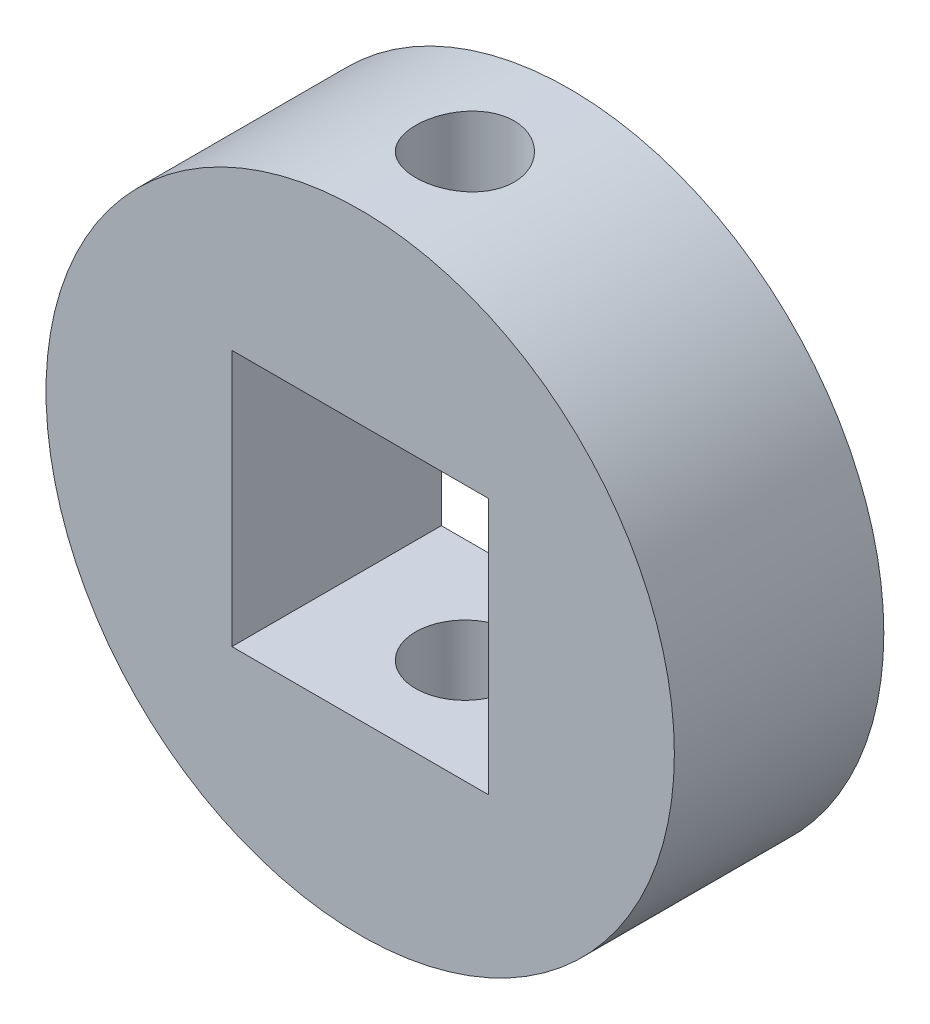
ISO-10303-21;
HEADER;
FILE_DESCRIPTION(('STEP AP214'),'2;1');
FILE_NAME('part.step','',(''),(''),'','','');
FILE_SCHEMA(('AUTOMOTIVE_DESIGN { 1 0 10303 214 1 1 1 1 }'));
ENDSEC;
DATA;
#1=APPLICATION_CONTEXT('core data for automotive mechanical design processes');
#2=APPLICATION_PROTOCOL_DEFINITION('international standard','automotive_design',2000,#1);
#3=PRODUCT_CONTEXT('',#1,'mechanical');
#4=PRODUCT('Part','Part','',(#3));
#5=PRODUCT_RELATED_PRODUCT_CATEGORY('part','',(#4));
#6=PRODUCT_DEFINITION_FORMATION('','',#4);
#7=PRODUCT_DEFINITION_CONTEXT('part definition',#1,'design');
#8=PRODUCT_DEFINITION('design','',#6,#7);
#9=PRODUCT_DEFINITION_SHAPE('','',#8);
#10=(LENGTH_UNIT() NAMED_UNIT(*) SI_UNIT(.MILLI.,.METRE.));
#11=(NAMED_UNIT(*) PLANE_ANGLE_UNIT() SI_UNIT($,.RADIAN.));
#12=(NAMED_UNIT(*) SI_UNIT($,.STERADIAN.) SOLID_ANGLE_UNIT());
#13=UNCERTAINTY_MEASURE_WITH_UNIT(LENGTH_MEASURE(1.E-05),#10,'distance_accuracy_value','');
#14=(GEOMETRIC_REPRESENTATION_CONTEXT(3) GLOBAL_UNCERTAINTY_ASSIGNED_CONTEXT((#13)) GLOBAL_UNIT_ASSIGNED_CONTEXT((#10,
#11,#12)) REPRESENTATION_CONTEXT('',''));
#15=CARTESIAN_POINT('',(0.,0.,0.));
#16=DIRECTION('',(0.,0.,1.));
#17=DIRECTION('',(1.,0.,0.));
#18=AXIS2_PLACEMENT_3D('',#15,#16,#17);
#19=CARTESIAN_POINT('',(0.,0.,10.));
#20=DIRECTION('',(0.,0.,-1.));
#21=DIRECTION('',(-1.,0.,0.));
#22=AXIS2_PLACEMENT_3D('',#19,#20,#21);
#23=CYLINDRICAL_SURFACE('',#22,15.);
#24=CARTESIAN_POINT('',(0.,-15.,2.65));
#25=CARTESIAN_POINT('',(0.131139660898044,-14.9999978361734,2.65000535255428));
#26=CARTESIAN_POINT('',(0.262353665254958,-14.9982622581592,2.66101426651047));
#27=CARTESIAN_POINT('',(0.521109191759034,-14.9915057642154,2.70474512698628));
#28=CARTESIAN_POINT('',(0.648647094187166,-14.9864817183713,2.73748775975335));
#29=CARTESIAN_POINT('',(0.896268668958393,-14.9737124613582,2.82367958932411));
#30=CARTESIAN_POINT('',(1.01635807129278,-14.9659693732295,2.87711263429627));
#31=CARTESIAN_POINT('',(1.24584930355545,-14.9486159955958,3.00312793190447));
#32=CARTESIAN_POINT('',(1.35525251322328,-14.9390059476222,3.07570770793492));
#33=CARTESIAN_POINT('',(1.56121194215454,-14.9188947815282,3.23861242927082));
#34=CARTESIAN_POINT('',(1.65766426455896,-14.908387449401,3.32906797752645));
#35=CARTESIAN_POINT('',(1.83408716820226,-14.8877141739286,3.52487545401223));
#36=CARTESIAN_POINT('',(1.91405676656269,-14.8775482509722,3.63022826994752));
#37=CARTESIAN_POINT('',(2.05565331588365,-14.8586485841044,3.85354392910894));
#38=CARTESIAN_POINT('',(2.11717887362618,-14.849922871282,3.97157180096984));
#39=CARTESIAN_POINT('',(2.21949273086052,-14.8349769839846,4.21644602606019));
#40=CARTESIAN_POINT('',(2.26028226470942,-14.8287566603753,4.34329185387045));
#41=CARTESIAN_POINT('',(2.31964169632593,-14.819587246494,4.60110514955549));
#42=CARTESIAN_POINT('',(2.33839006645025,-14.8166118953593,4.73203057432345));
#43=CARTESIAN_POINT('',(2.35368804508271,-14.8141896975842,4.99520030070813));
#44=CARTESIAN_POINT('',(2.35023904265227,-14.8147426301517,5.12744451928063));
#45=CARTESIAN_POINT('',(2.32138584481618,-14.8192905254067,5.38823202691378));
#46=CARTESIAN_POINT('',(2.29618108524076,-14.8232542204937,5.51679800544147));
#47=CARTESIAN_POINT('',(2.22484434548323,-14.8341281502165,5.76785333046548));
#48=CARTESIAN_POINT('',(2.17871172426469,-14.8410384751095,5.89034249069668));
#49=CARTESIAN_POINT('',(2.06662340412997,-14.8570612884526,6.12637017261523));
#50=CARTESIAN_POINT('',(2.00058387451803,-14.8661830571557,6.23986822770412));
#51=CARTESIAN_POINT('',(1.85061598743152,-14.8855943625636,6.45424751288462));
#52=CARTESIAN_POINT('',(1.76668635101904,-14.8958839827318,6.55512784013451));
#53=CARTESIAN_POINT('',(1.58222911362538,-14.9166094686365,6.7425633551819));
#54=CARTESIAN_POINT('',(1.48153018043511,-14.9270457038918,6.82894998125264));
#55=CARTESIAN_POINT('',(1.26697502121761,-14.9467843010259,6.98362384183475));
#56=CARTESIAN_POINT('',(1.15311872770309,-14.9560866570884,7.05191098350355));
#57=CARTESIAN_POINT('',(0.915329903590906,-14.9725203977478,7.16845870000818));
#58=CARTESIAN_POINT('',(0.79139053123928,-14.9796502924149,7.21670553889051));
#59=CARTESIAN_POINT('',(0.537031730392993,-14.9909235142315,7.29165273161601));
#60=CARTESIAN_POINT('',(0.406612780962246,-14.9950670618246,7.31835467585979));
#61=CARTESIAN_POINT('',(0.144450984147516,-14.9998713553014,7.34922827631233));
#62=CARTESIAN_POINT('',(0.0127360443573584,-15.000567901868,7.35363153871558));
#63=CARTESIAN_POINT('',(-0.249550610893128,-14.9984973979234,7.34039859126271));
#64=CARTESIAN_POINT('',(-0.380122364912233,-14.9957304646895,7.32276312766219));
#65=CARTESIAN_POINT('',(-0.635709283664057,-14.9870660426238,7.26614594997219));
#66=CARTESIAN_POINT('',(-0.760750214245151,-14.9811852111064,7.22727778220792));
#67=CARTESIAN_POINT('',(-1.00254079598021,-14.9669500366505,7.12941876603703));
#68=CARTESIAN_POINT('',(-1.11929002720244,-14.9585955685457,7.0704268993458));
#69=CARTESIAN_POINT('',(-1.34219675447322,-14.9402519653253,6.93345670068688));
#70=CARTESIAN_POINT('',(-1.44826347060732,-14.9302504596309,6.85533232030348));
#71=CARTESIAN_POINT('',(-1.64586340887377,-14.9097625910217,6.68251714709005));
#72=CARTESIAN_POINT('',(-1.73739570442064,-14.8992761972496,6.58782529887371));
#73=CARTESIAN_POINT('',(-1.90417741188964,-14.8788860389629,6.38352904400049));
#74=CARTESIAN_POINT('',(-1.97927108383918,-14.868988444147,6.27379678482385));
#75=CARTESIAN_POINT('',(-2.1099593855471,-14.8510080932914,6.04313959072472));
#76=CARTESIAN_POINT('',(-2.16555457890463,-14.842925284798,5.92221497944238));
#77=CARTESIAN_POINT('',(-2.25542966460249,-14.8295349812276,5.6730588471815));
#78=CARTESIAN_POINT('',(-2.28978978953747,-14.8242170518373,5.54485685327595));
#79=CARTESIAN_POINT('',(-2.33647367231235,-14.8169314823007,5.28441172926842));
#80=CARTESIAN_POINT('',(-2.34879910322156,-14.8149635877907,5.15216890675754));
#81=CARTESIAN_POINT('',(-2.35102125119129,-14.8146109734745,4.88894938561891));
#82=CARTESIAN_POINT('',(-2.34116293922014,-14.816187117362,4.75797474222718));
#83=CARTESIAN_POINT('',(-2.29982424400806,-14.8226596550536,4.49957124228243));
#84=CARTESIAN_POINT('',(-2.26834390844419,-14.8275560415364,4.37214237791152));
#85=CARTESIAN_POINT('',(-2.18474423965185,-14.8401032185423,4.1245260033516));
#86=CARTESIAN_POINT('',(-2.1326435752882,-14.8477515170208,4.00433205603259));
#87=CARTESIAN_POINT('',(-2.00930684436244,-14.8649435263944,3.77435150515524));
#88=CARTESIAN_POINT('',(-1.93807001193855,-14.8744873131462,3.66456531837103));
#89=CARTESIAN_POINT('',(-1.77759913491021,-14.8945201127208,3.45727473748198));
#90=CARTESIAN_POINT('',(-1.68818410764271,-14.9050179921569,3.3599112875007));
#91=CARTESIAN_POINT('',(-1.49427740375294,-14.925703399043,3.18148513176802));
#92=CARTESIAN_POINT('',(-1.38978223858469,-14.935890854019,3.10042620822012));
#93=CARTESIAN_POINT('',(-1.16793596458089,-14.9548782547401,2.95646863448212));
#94=CARTESIAN_POINT('',(-1.05051105008816,-14.9636694524559,2.89368257652532));
#95=CARTESIAN_POINT('',(-0.806696486423395,-14.9787883674071,2.78882043772767));
#96=CARTESIAN_POINT('',(-0.680316135914554,-14.9851185968715,2.74672322544125));
#97=CARTESIAN_POINT('',(-0.461164612904092,-14.9931818943855,2.69382459299744));
#98=CARTESIAN_POINT('',(-0.369736128308476,-14.995725346647,2.67741594902605));
#99=CARTESIAN_POINT('',(-0.185550824331083,-14.9991351531205,2.65550183611666));
#100=CARTESIAN_POINT('',(-0.092794023806651,-15.0000015311171,2.64999621254893));
#101=CARTESIAN_POINT('',(0.,-15.,2.65));
#102=B_SPLINE_CURVE_WITH_KNOTS('',3,(#24,#25,#26,#27,#28,#29,#30,#31,#32,#33,#34,#35,#36,#37,
#38,#39,#40,#41,#42,#43,#44,#45,#46,#47,#48,#49,#50,#51,#52,#53,#54,#55,#56,#57,#58,#59,#60,#61,
#62,#63,#64,#65,#66,#67,#68,#69,#70,#71,#72,#73,#74,#75,#76,#77,#78,#79,#80,#81,#82,#83,#84,#85,
#86,#87,#88,#89,#90,#91,#92,#93,#94,#95,#96,#97,#98,#99,#100,#101),.UNSPECIFIED.,.T.,.F.,(4,2,2,
2,2,2,2,2,2,2,2,2,2,2,2,2,2,2,2,2,2,2,2,2,2,2,2,2,2,2,2,2,2,2,2,2,2,2,4),(0.,0.39307986132718,
0.78653439527755,1.17968239879326,1.57277957402255,1.96886267856085,2.36496939503274,
2.7632153148109,3.16143752535428,3.55641253135778,3.95136282095827,4.34273057961662,
4.73411032697895,5.12716181550264,5.52024141213941,5.91761585386107,6.31499233390312,
6.7126407346658,7.11025977914034,7.50374034156155,7.89720758065744,8.28859098162506,
8.67999419002609,9.07448378292461,9.46899851488541,9.86710302191477,10.2651960208742,
10.6617755567573,11.058324979527,11.45051689558,11.8427079468438,12.234544732465,
12.6263972023935,13.0223609364439,13.4184164175711,13.8168629775311,14.2149017166795,
14.4930477716295,14.7711898818052),.UNSPECIFIED.);
#103=CARTESIAN_POINT('',(0.,-15.,2.65));
#104=VERTEX_POINT('',#103);
#105=EDGE_CURVE('E132',#104,#104,#102,.T.);
#106=ORIENTED_EDGE('',*,*,#105,.F.);
#107=EDGE_LOOP('',(#106));
#108=FACE_BOUND('',#107,.T.);
#109=CARTESIAN_POINT('',(0.,0.,10.));
#110=DIRECTION('',(0.,0.,1.));
#111=DIRECTION('',(1.,0.,0.));
#112=AXIS2_PLACEMENT_3D('',#109,#110,#111);
#113=CIRCLE('',#112,15.);
#114=CARTESIAN_POINT('',(15.,0.,10.));
#115=VERTEX_POINT('',#114);
#116=EDGE_CURVE('E11',#115,#115,#113,.T.);
#117=ORIENTED_EDGE('',*,*,#116,.F.);
#118=EDGE_LOOP('',(#117));
#119=FACE_BOUND('',#118,.T.);
#120=CARTESIAN_POINT('',(0.,0.,0.));
#121=DIRECTION('',(0.,0.,1.));
#122=DIRECTION('',(1.,0.,0.));
#123=AXIS2_PLACEMENT_3D('',#120,#121,#122);
#124=CIRCLE('',#123,15.);
#125=CARTESIAN_POINT('',(15.,0.,0.));
#126=VERTEX_POINT('',#125);
#127=EDGE_CURVE('E42',#126,#126,#124,.T.);
#128=ORIENTED_EDGE('',*,*,#127,.T.);
#129=EDGE_LOOP('',(#128));
#130=FACE_BOUND('',#129,.T.);
#131=CARTESIAN_POINT('',(0.,15.,2.65));
#132=CARTESIAN_POINT('',(-0.131139660898044,14.9999978361734,2.65000535255428));
#133=CARTESIAN_POINT('',(-0.262353665254958,14.9982622581592,2.66101426651047));
#134=CARTESIAN_POINT('',(-0.521109191759034,14.9915057642154,2.70474512698628));
#135=CARTESIAN_POINT('',(-0.648647094187166,14.9864817183713,2.73748775975335));
#136=CARTESIAN_POINT('',(-0.896268668958393,14.9737124613582,2.82367958932411));
#137=CARTESIAN_POINT('',(-1.01635807129278,14.9659693732295,2.87711263429627));
#138=CARTESIAN_POINT('',(-1.24584930355545,14.9486159955958,3.00312793190447));
#139=CARTESIAN_POINT('',(-1.35525251322328,14.9390059476222,3.07570770793492));
#140=CARTESIAN_POINT('',(-1.56121194215454,14.9188947815282,3.23861242927082));
#141=CARTESIAN_POINT('',(-1.65766426455896,14.908387449401,3.32906797752645));
#142=CARTESIAN_POINT('',(-1.83408716820226,14.8877141739286,3.52487545401223));
#143=CARTESIAN_POINT('',(-1.91405676656269,14.8775482509722,3.63022826994752));
#144=CARTESIAN_POINT('',(-2.05565331588365,14.8586485841044,3.85354392910894));
#145=CARTESIAN_POINT('',(-2.11717887362618,14.849922871282,3.97157180096984));
#146=CARTESIAN_POINT('',(-2.21949273086052,14.8349769839846,4.21644602606019));
#147=CARTESIAN_POINT('',(-2.26028226470942,14.8287566603753,4.34329185387045));
#148=CARTESIAN_POINT('',(-2.31964169632593,14.819587246494,4.60110514955549));
#149=CARTESIAN_POINT('',(-2.33839006645025,14.8166118953593,4.73203057432345));
#150=CARTESIAN_POINT('',(-2.35368804508271,14.8141896975842,4.99520030070813));
#151=CARTESIAN_POINT('',(-2.35023904265227,14.8147426301517,5.12744451928063));
#152=CARTESIAN_POINT('',(-2.32138584481618,14.8192905254067,5.38823202691378));
#153=CARTESIAN_POINT('',(-2.29618108524076,14.8232542204937,5.51679800544147));
#154=CARTESIAN_POINT('',(-2.22484434548323,14.8341281502165,5.76785333046548));
#155=CARTESIAN_POINT('',(-2.17871172426469,14.8410384751095,5.89034249069668));
#156=CARTESIAN_POINT('',(-2.06662340412997,14.8570612884526,6.12637017261523));
#157=CARTESIAN_POINT('',(-2.00058387451803,14.8661830571557,6.23986822770412));
#158=CARTESIAN_POINT('',(-1.85061598743152,14.8855943625636,6.45424751288462));
#159=CARTESIAN_POINT('',(-1.76668635101904,14.8958839827318,6.55512784013451));
#160=CARTESIAN_POINT('',(-1.58222911362538,14.9166094686365,6.7425633551819));
#161=CARTESIAN_POINT('',(-1.48153018043511,14.9270457038918,6.82894998125264));
#162=CARTESIAN_POINT('',(-1.26697502121761,14.9467843010259,6.98362384183475));
#163=CARTESIAN_POINT('',(-1.15311872770309,14.9560866570884,7.05191098350355));
#164=CARTESIAN_POINT('',(-0.915329903590906,14.9725203977478,7.16845870000818));
#165=CARTESIAN_POINT('',(-0.79139053123928,14.9796502924149,7.21670553889051));
#166=CARTESIAN_POINT('',(-0.537031730392993,14.9909235142315,7.29165273161601));
#167=CARTESIAN_POINT('',(-0.406612780962246,14.9950670618246,7.31835467585979));
#168=CARTESIAN_POINT('',(-0.144450984147516,14.9998713553014,7.34922827631233));
#169=CARTESIAN_POINT('',(-0.0127360443573584,15.000567901868,7.35363153871558));
#170=CARTESIAN_POINT('',(0.249550610893128,14.9984973979234,7.34039859126271));
#171=CARTESIAN_POINT('',(0.380122364912233,14.9957304646895,7.32276312766219));
#172=CARTESIAN_POINT('',(0.635709283664057,14.9870660426238,7.26614594997219));
#173=CARTESIAN_POINT('',(0.760750214245151,14.9811852111064,7.22727778220792));
#174=CARTESIAN_POINT('',(1.00254079598021,14.9669500366505,7.12941876603703));
#175=CARTESIAN_POINT('',(1.11929002720244,14.9585955685457,7.0704268993458));
#176=CARTESIAN_POINT('',(1.34219675447322,14.9402519653253,6.93345670068688));
#177=CARTESIAN_POINT('',(1.44826347060732,14.9302504596309,6.85533232030348));
#178=CARTESIAN_POINT('',(1.64586340887377,14.9097625910217,6.68251714709005));
#179=CARTESIAN_POINT('',(1.73739570442064,14.8992761972496,6.58782529887371));
#180=CARTESIAN_POINT('',(1.90417741188964,14.8788860389629,6.38352904400049));
#181=CARTESIAN_POINT('',(1.97927108383918,14.868988444147,6.27379678482385));
#182=CARTESIAN_POINT('',(2.1099593855471,14.8510080932914,6.04313959072472));
#183=CARTESIAN_POINT('',(2.16555457890463,14.842925284798,5.92221497944238));
#184=CARTESIAN_POINT('',(2.25542966460249,14.8295349812276,5.6730588471815));
#185=CARTESIAN_POINT('',(2.28978978953747,14.8242170518373,5.54485685327595));
#186=CARTESIAN_POINT('',(2.33647367231235,14.8169314823007,5.28441172926842));
#187=CARTESIAN_POINT('',(2.34879910322156,14.8149635877907,5.15216890675754));
#188=CARTESIAN_POINT('',(2.35102125119129,14.8146109734745,4.88894938561891));
#189=CARTESIAN_POINT('',(2.34116293922014,14.816187117362,4.75797474222718));
#190=CARTESIAN_POINT('',(2.29982424400806,14.8226596550536,4.49957124228243));
#191=CARTESIAN_POINT('',(2.26834390844419,14.8275560415364,4.37214237791152));
#192=CARTESIAN_POINT('',(2.18474423965185,14.8401032185423,4.1245260033516));
#193=CARTESIAN_POINT('',(2.1326435752882,14.8477515170208,4.00433205603259));
#194=CARTESIAN_POINT('',(2.00930684436244,14.8649435263944,3.77435150515524));
#195=CARTESIAN_POINT('',(1.93807001193855,14.8744873131462,3.66456531837103));
#196=CARTESIAN_POINT('',(1.77759913491021,14.8945201127208,3.45727473748198));
#197=CARTESIAN_POINT('',(1.68818410764271,14.9050179921569,3.3599112875007));
#198=CARTESIAN_POINT('',(1.49427740375294,14.925703399043,3.18148513176802));
#199=CARTESIAN_POINT('',(1.38978223858469,14.935890854019,3.10042620822012));
#200=CARTESIAN_POINT('',(1.16793596458089,14.9548782547401,2.95646863448212));
#201=CARTESIAN_POINT('',(1.05051105008816,14.9636694524559,2.89368257652532));
#202=CARTESIAN_POINT('',(0.806696486423395,14.9787883674071,2.78882043772767));
#203=CARTESIAN_POINT('',(0.680316135914554,14.9851185968715,2.74672322544125));
#204=CARTESIAN_POINT('',(0.461164612904092,14.9931818943855,2.69382459299744));
#205=CARTESIAN_POINT('',(0.369736128308476,14.995725346647,2.67741594902605));
#206=CARTESIAN_POINT('',(0.185550824331083,14.9991351531205,2.65550183611666));
#207=CARTESIAN_POINT('',(0.092794023806651,15.0000015311171,2.64999621254893));
#208=CARTESIAN_POINT('',(0.,15.,2.65));
#209=B_SPLINE_CURVE_WITH_KNOTS('',3,(#131,#132,#133,#134,#135,#136,#137,#138,#139,#140,#141,
#142,#143,#144,#145,#146,#147,#148,#149,#150,#151,#152,#153,#154,#155,#156,#157,#158,#159,#160,
#161,#162,#163,#164,#165,#166,#167,#168,#169,#170,#171,#172,#173,#174,#175,#176,#177,#178,#179,
#180,#181,#182,#183,#184,#185,#186,#187,#188,#189,#190,#191,#192,#193,#194,#195,#196,#197,#198,
#199,#200,#201,#202,#203,#204,#205,#206,#207,#208),.UNSPECIFIED.,.T.,.F.,(4,2,2,2,2,2,2,2,2,2,2,
2,2,2,2,2,2,2,2,2,2,2,2,2,2,2,2,2,2,2,2,2,2,2,2,2,2,2,4),(0.,0.39307986132718,0.78653439527755,
1.17968239879326,1.57277957402255,1.96886267856085,2.36496939503274,2.7632153148109,
3.16143752535428,3.55641253135778,3.95136282095827,4.34273057961662,4.73411032697895,
5.12716181550264,5.52024141213941,5.91761585386107,6.31499233390312,6.7126407346658,
7.11025977914034,7.50374034156155,7.89720758065744,8.28859098162506,8.67999419002609,
9.07448378292461,9.46899851488541,9.86710302191477,10.2651960208742,10.6617755567573,
11.058324979527,11.45051689558,11.8427079468438,12.234544732465,12.6263972023935,
13.0223609364439,13.4184164175711,13.8168629775311,14.2149017166795,14.4930477716295,
14.7711898818052),.UNSPECIFIED.);
#210=CARTESIAN_POINT('',(0.,15.,2.65));
#211=VERTEX_POINT('',#210);
#212=EDGE_CURVE('E105',#211,#211,#209,.T.);
#213=ORIENTED_EDGE('',*,*,#212,.F.);
#214=EDGE_LOOP('',(#213));
#215=FACE_BOUND('',#214,.T.);
#216=ADVANCED_FACE('F33',(#108,#119,#130,#215),#23,.T.);
#217=CARTESIAN_POINT('',(6.125,-6.125,10.));
#218=DIRECTION('',(0.,1.,0.));
#219=DIRECTION('',(-1.,0.,0.));
#220=AXIS2_PLACEMENT_3D('',#217,#218,#219);
#221=PLANE('',#220);
#222=DIRECTION('',(1.,0.,0.));
#223=VECTOR('',#222,1.);
#224=CARTESIAN_POINT('',(6.125,-6.125,0.));
#225=LINE('',#224,#223);
#226=CARTESIAN_POINT('',(-6.125,-6.125,0.));
#227=VERTEX_POINT('',#226);
#228=CARTESIAN_POINT('',(6.125,-6.125,0.));
#229=VERTEX_POINT('',#228);
#230=EDGE_CURVE('E92',#227,#229,#225,.T.);
#231=ORIENTED_EDGE('',*,*,#230,.F.);
#232=DIRECTION('',(0.,0.,-1.));
#233=VECTOR('',#232,1.);
#234=CARTESIAN_POINT('',(-6.125,-6.125,10.));
#235=LINE('',#234,#233);
#236=CARTESIAN_POINT('',(-6.125,-6.125,10.));
#237=VERTEX_POINT('',#236);
#238=EDGE_CURVE('E79',#237,#227,#235,.T.);
#239=ORIENTED_EDGE('',*,*,#238,.F.);
#240=DIRECTION('',(1.,0.,0.));
#241=VECTOR('',#240,1.);
#242=CARTESIAN_POINT('',(6.125,-6.125,10.));
#243=LINE('',#242,#241);
#244=CARTESIAN_POINT('',(6.125,-6.125,10.));
#245=VERTEX_POINT('',#244);
#246=EDGE_CURVE('E84',#237,#245,#243,.T.);
#247=ORIENTED_EDGE('',*,*,#246,.T.);
#248=DIRECTION('',(0.,0.,-1.));
#249=VECTOR('',#248,1.);
#250=CARTESIAN_POINT('',(6.125,-6.125,10.));
#251=LINE('',#250,#249);
#252=EDGE_CURVE('E93',#245,#229,#251,.T.);
#253=ORIENTED_EDGE('',*,*,#252,.T.);
#254=EDGE_LOOP('',(#231,#239,#247,#253));
#255=FACE_BOUND('',#254,.T.);
#256=CARTESIAN_POINT('',(0.,-6.125,5.));
#257=DIRECTION('',(0.,1.,0.));
#258=DIRECTION('',(-1.,0.,0.));
#259=AXIS2_PLACEMENT_3D('',#256,#257,#258);
#260=CIRCLE('',#259,2.35);
#261=CARTESIAN_POINT('',(-2.35,-6.125,5.));
#262=VERTEX_POINT('',#261);
#263=EDGE_CURVE('E130',#262,#262,#260,.F.);
#264=ORIENTED_EDGE('',*,*,#263,.T.);
#265=EDGE_LOOP('',(#264));
#266=FACE_BOUND('',#265,.T.);
#267=ADVANCED_FACE('F88',(#255,#266),#221,.T.);
#268=CARTESIAN_POINT('',(6.125,6.125,10.));
#269=DIRECTION('',(0.,-1.,0.));
#270=DIRECTION('',(1.,0.,0.));
#271=AXIS2_PLACEMENT_3D('',#268,#269,#270);
#272=PLANE('',#271);
#273=DIRECTION('',(-1.,0.,0.));
#274=VECTOR('',#273,1.);
#275=CARTESIAN_POINT('',(6.125,6.125,0.));
#276=LINE('',#275,#274);
#277=CARTESIAN_POINT('',(6.125,6.125,0.));
#278=VERTEX_POINT('',#277);
#279=CARTESIAN_POINT('',(-6.125,6.125,0.));
#280=VERTEX_POINT('',#279);
#281=EDGE_CURVE('E85',#278,#280,#276,.T.);
#282=ORIENTED_EDGE('',*,*,#281,.F.);
#283=DIRECTION('',(0.,0.,-1.));
#284=VECTOR('',#283,1.);
#285=CARTESIAN_POINT('',(6.125,6.125,10.));
#286=LINE('',#285,#284);
#287=CARTESIAN_POINT('',(6.125,6.125,10.));
#288=VERTEX_POINT('',#287);
#289=EDGE_CURVE('E50',#288,#278,#286,.T.);
#290=ORIENTED_EDGE('',*,*,#289,.F.);
#291=DIRECTION('',(-1.,0.,0.));
#292=VECTOR('',#291,1.);
#293=CARTESIAN_POINT('',(6.125,6.125,10.));
#294=LINE('',#293,#292);
#295=CARTESIAN_POINT('',(-6.125,6.125,10.));
#296=VERTEX_POINT('',#295);
#297=EDGE_CURVE('E99',#288,#296,#294,.T.);
#298=ORIENTED_EDGE('',*,*,#297,.T.);
#299=DIRECTION('',(0.,0.,-1.));
#300=VECTOR('',#299,1.);
#301=CARTESIAN_POINT('',(-6.125,6.125,10.));
#302=LINE('',#301,#300);
#303=EDGE_CURVE('E80',#296,#280,#302,.T.);
#304=ORIENTED_EDGE('',*,*,#303,.T.);
#305=EDGE_LOOP('',(#282,#290,#298,#304));
#306=FACE_BOUND('',#305,.T.);
#307=CARTESIAN_POINT('',(0.,6.125,5.));
#308=DIRECTION('',(0.,-1.,0.));
#309=DIRECTION('',(1.,0.,0.));
#310=AXIS2_PLACEMENT_3D('',#307,#308,#309);
#311=CIRCLE('',#310,2.35);
#312=CARTESIAN_POINT('',(2.35,6.125,5.));
#313=VERTEX_POINT('',#312);
#314=EDGE_CURVE('E37',#313,#313,#311,.F.);
#315=ORIENTED_EDGE('',*,*,#314,.T.);
#316=EDGE_LOOP('',(#315));
#317=FACE_BOUND('',#316,.T.);
#318=ADVANCED_FACE('F123',(#306,#317),#272,.T.);
#319=CARTESIAN_POINT('',(0.,0.,10.));
#320=DIRECTION('',(0.,0.,1.));
#321=DIRECTION('',(1.,0.,0.));
#322=AXIS2_PLACEMENT_3D('',#319,#320,#321);
#323=PLANE('',#322);
#324=ORIENTED_EDGE('',*,*,#116,.T.);
#325=EDGE_LOOP('',(#324));
#326=FACE_BOUND('',#325,.T.);
#327=ORIENTED_EDGE('',*,*,#246,.F.);
#328=DIRECTION('',(0.,-1.,0.));
#329=VECTOR('',#328,1.);
#330=CARTESIAN_POINT('',(-6.125,6.125,10.));
#331=LINE('',#330,#329);
#332=EDGE_CURVE('E76',#296,#237,#331,.T.);
#333=ORIENTED_EDGE('',*,*,#332,.F.);
#334=ORIENTED_EDGE('',*,*,#297,.F.);
#335=DIRECTION('',(0.,1.,0.));
#336=VECTOR('',#335,1.);
#337=CARTESIAN_POINT('',(6.125,6.125,10.));
#338=LINE('',#337,#336);
#339=EDGE_CURVE('E97',#245,#288,#338,.T.);
#340=ORIENTED_EDGE('',*,*,#339,.F.);
#341=EDGE_LOOP('',(#327,#333,#334,#340));
#342=FACE_BOUND('',#341,.T.);
#343=ADVANCED_FACE('F96',(#326,#342),#323,.T.);
#344=CARTESIAN_POINT('',(0.,0.,0.));
#345=DIRECTION('',(0.,0.,1.));
#346=DIRECTION('',(1.,0.,0.));
#347=AXIS2_PLACEMENT_3D('',#344,#345,#346);
#348=PLANE('',#347);
#349=ORIENTED_EDGE('',*,*,#127,.F.);
#350=EDGE_LOOP('',(#349));
#351=FACE_BOUND('',#350,.T.);
#352=DIRECTION('',(0.,-1.,0.));
#353=VECTOR('',#352,1.);
#354=CARTESIAN_POINT('',(-6.125,6.125,0.));
#355=LINE('',#354,#353);
#356=EDGE_CURVE('E58',#280,#227,#355,.T.);
#357=ORIENTED_EDGE('',*,*,#356,.T.);
#358=ORIENTED_EDGE('',*,*,#230,.T.);
#359=DIRECTION('',(0.,1.,0.));
#360=VECTOR('',#359,1.);
#361=CARTESIAN_POINT('',(6.125,6.125,0.));
#362=LINE('',#361,#360);
#363=EDGE_CURVE('E107',#229,#278,#362,.T.);
#364=ORIENTED_EDGE('',*,*,#363,.T.);
#365=ORIENTED_EDGE('',*,*,#281,.T.);
#366=EDGE_LOOP('',(#357,#358,#364,#365));
#367=FACE_BOUND('',#366,.T.);
#368=ADVANCED_FACE('F119',(#351,#367),#348,.F.);
#369=CARTESIAN_POINT('',(-6.125,6.125,10.));
#370=DIRECTION('',(1.,0.,0.));
#371=DIRECTION('',(0.,1.,0.));
#372=AXIS2_PLACEMENT_3D('',#369,#370,#371);
#373=PLANE('',#372);
#374=ORIENTED_EDGE('',*,*,#356,.F.);
#375=ORIENTED_EDGE('',*,*,#303,.F.);
#376=ORIENTED_EDGE('',*,*,#332,.T.);
#377=ORIENTED_EDGE('',*,*,#238,.T.);
#378=EDGE_LOOP('',(#374,#375,#376,#377));
#379=FACE_BOUND('',#378,.T.);
#380=ADVANCED_FACE('F78',(#379),#373,.T.);
#381=CARTESIAN_POINT('',(6.125,6.125,10.));
#382=DIRECTION('',(-1.,0.,0.));
#383=DIRECTION('',(0.,-1.,0.));
#384=AXIS2_PLACEMENT_3D('',#381,#382,#383);
#385=PLANE('',#384);
#386=ORIENTED_EDGE('',*,*,#363,.F.);
#387=ORIENTED_EDGE('',*,*,#252,.F.);
#388=ORIENTED_EDGE('',*,*,#339,.T.);
#389=ORIENTED_EDGE('',*,*,#289,.T.);
#390=EDGE_LOOP('',(#386,#387,#388,#389));
#391=FACE_BOUND('',#390,.T.);
#392=ADVANCED_FACE('F146',(#391),#385,.T.);
#393=CARTESIAN_POINT('',(0.,24.,5.));
#394=DIRECTION('',(0.,-1.,0.));
#395=DIRECTION('',(0.,0.,-1.));
#396=AXIS2_PLACEMENT_3D('',#393,#394,#395);
#397=CYLINDRICAL_SURFACE('',#396,2.35);
#398=ORIENTED_EDGE('',*,*,#314,.F.);
#399=EDGE_LOOP('',(#398));
#400=FACE_BOUND('',#399,.T.);
#401=ORIENTED_EDGE('',*,*,#212,.T.);
#402=EDGE_LOOP('',(#401));
#403=FACE_BOUND('',#402,.T.);
#404=ADVANCED_FACE('F142',(#400,#403),#397,.F.);
#405=ORIENTED_EDGE('',*,*,#263,.F.);
#406=EDGE_LOOP('',(#405));
#407=FACE_BOUND('',#406,.T.);
#408=ORIENTED_EDGE('',*,*,#105,.T.);
#409=EDGE_LOOP('',(#408));
#410=FACE_BOUND('',#409,.T.);
#411=ADVANCED_FACE('F145',(#407,#410),#397,.F.);
#412=CLOSED_SHELL('',(#216,#267,#318,#343,#368,#380,#392,#404,#411));
#413=MANIFOLD_SOLID_BREP('B2',#412);
#414=ADVANCED_BREP_SHAPE_REPRESENTATION('',(#18,#413),#14);
#415=SHAPE_DEFINITION_REPRESENTATION(#9,#414);
ENDSEC;
END-ISO-10303-21;
